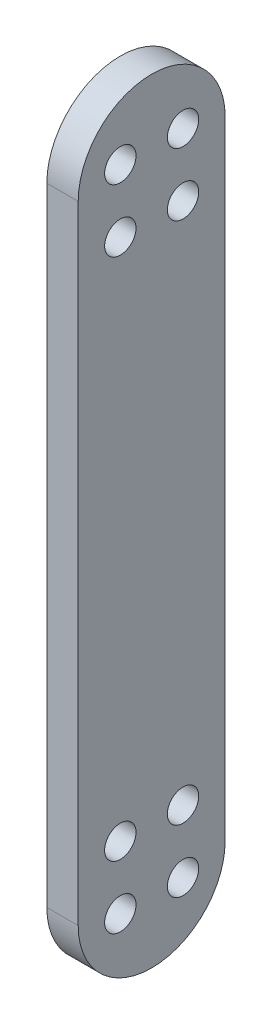
ISO-10303-21;
HEADER;
FILE_DESCRIPTION(('STEP AP214'),'2;1');
FILE_NAME('part.step','',(''),(''),'','','');
FILE_SCHEMA(('AUTOMOTIVE_DESIGN { 1 0 10303 214 1 1 1 1 }'));
ENDSEC;
DATA;
#1=APPLICATION_CONTEXT('core data for automotive mechanical design processes');
#2=APPLICATION_PROTOCOL_DEFINITION('international standard','automotive_design',2000,#1);
#3=PRODUCT_CONTEXT('',#1,'mechanical');
#4=PRODUCT('Part','Part','',(#3));
#5=PRODUCT_RELATED_PRODUCT_CATEGORY('part','',(#4));
#6=PRODUCT_DEFINITION_FORMATION('','',#4);
#7=PRODUCT_DEFINITION_CONTEXT('part definition',#1,'design');
#8=PRODUCT_DEFINITION('design','',#6,#7);
#9=PRODUCT_DEFINITION_SHAPE('','',#8);
#10=(LENGTH_UNIT() NAMED_UNIT(*) SI_UNIT(.MILLI.,.METRE.));
#11=(NAMED_UNIT(*) PLANE_ANGLE_UNIT() SI_UNIT($,.RADIAN.));
#12=(NAMED_UNIT(*) SI_UNIT($,.STERADIAN.) SOLID_ANGLE_UNIT());
#13=UNCERTAINTY_MEASURE_WITH_UNIT(LENGTH_MEASURE(1.E-05),#10,'distance_accuracy_value','');
#14=(GEOMETRIC_REPRESENTATION_CONTEXT(3) GLOBAL_UNCERTAINTY_ASSIGNED_CONTEXT((#13)) GLOBAL_UNIT_ASSIGNED_CONTEXT((#10,
#11,#12)) REPRESENTATION_CONTEXT('',''));
#15=CARTESIAN_POINT('',(0.,0.,0.));
#16=DIRECTION('',(0.,0.,1.));
#17=DIRECTION('',(1.,0.,0.));
#18=AXIS2_PLACEMENT_3D('',#15,#16,#17);
#19=CARTESIAN_POINT('',(0.,0.,0.));
#20=DIRECTION('',(-1.,0.,0.));
#21=DIRECTION('',(0.,0.,1.));
#22=AXIS2_PLACEMENT_3D('',#19,#20,#21);
#23=PLANE('',#22);
#24=CARTESIAN_POINT('',(0.,125.413224236194,25.));
#25=DIRECTION('',(-1.,0.,0.));
#26=DIRECTION('',(0.,0.,1.));
#27=AXIS2_PLACEMENT_3D('',#24,#25,#26);
#28=CIRCLE('',#27,2.5);
#29=CARTESIAN_POINT('',(0.,125.413224236194,27.5));
#30=VERTEX_POINT('',#29);
#31=EDGE_CURVE('E139',#30,#30,#28,.T.);
#32=ORIENTED_EDGE('',*,*,#31,.T.);
#33=EDGE_LOOP('',(#32));
#34=FACE_BOUND('',#33,.T.);
#35=CARTESIAN_POINT('',(0.,125.413224236194,15.));
#36=DIRECTION('',(-1.,0.,0.));
#37=DIRECTION('',(0.,0.,1.));
#38=AXIS2_PLACEMENT_3D('',#35,#36,#37);
#39=CIRCLE('',#38,2.5);
#40=CARTESIAN_POINT('',(0.,125.413224236194,17.5));
#41=VERTEX_POINT('',#40);
#42=EDGE_CURVE('E123',#41,#41,#39,.T.);
#43=ORIENTED_EDGE('',*,*,#42,.T.);
#44=EDGE_LOOP('',(#43));
#45=FACE_BOUND('',#44,.T.);
#46=CARTESIAN_POINT('',(0.,135.413224236194,25.));
#47=DIRECTION('',(-1.,0.,0.));
#48=DIRECTION('',(0.,0.,1.));
#49=AXIS2_PLACEMENT_3D('',#46,#47,#48);
#50=CIRCLE('',#49,2.5);
#51=CARTESIAN_POINT('',(0.,135.413224236194,27.5));
#52=VERTEX_POINT('',#51);
#53=EDGE_CURVE('E119',#52,#52,#50,.T.);
#54=ORIENTED_EDGE('',*,*,#53,.T.);
#55=EDGE_LOOP('',(#54));
#56=FACE_BOUND('',#55,.T.);
#57=CARTESIAN_POINT('',(0.,135.413224236194,15.));
#58=DIRECTION('',(-1.,0.,0.));
#59=DIRECTION('',(0.,0.,1.));
#60=AXIS2_PLACEMENT_3D('',#57,#58,#59);
#61=CIRCLE('',#60,2.5);
#62=CARTESIAN_POINT('',(0.,135.413224236194,17.5));
#63=VERTEX_POINT('',#62);
#64=EDGE_CURVE('E116',#63,#63,#61,.T.);
#65=ORIENTED_EDGE('',*,*,#64,.T.);
#66=EDGE_LOOP('',(#65));
#67=FACE_BOUND('',#66,.T.);
#68=CARTESIAN_POINT('',(0.,133.697961809387,20.));
#69=DIRECTION('',(-1.,0.,0.));
#70=DIRECTION('',(0.,0.,1.));
#71=AXIS2_PLACEMENT_3D('',#68,#69,#70);
#72=CIRCLE('',#71,11.715262426807);
#73=CARTESIAN_POINT('',(0.,133.697961809387,31.715262426807));
#74=VERTEX_POINT('',#73);
#75=CARTESIAN_POINT('',(0.,133.697961809387,8.28473757319303));
#76=VERTEX_POINT('',#75);
#77=EDGE_CURVE('E135',#74,#76,#72,.T.);
#78=ORIENTED_EDGE('',*,*,#77,.F.);
#79=DIRECTION('',(0.,-1.,0.));
#80=VECTOR('',#79,1.);
#81=CARTESIAN_POINT('',(0.,0.,31.715262426807));
#82=LINE('',#81,#80);
#83=CARTESIAN_POINT('',(0.,33.6979618093871,31.715262426807));
#84=VERTEX_POINT('',#83);
#85=EDGE_CURVE('E55',#74,#84,#82,.T.);
#86=ORIENTED_EDGE('',*,*,#85,.T.);
#87=CARTESIAN_POINT('',(0.,33.6979618093871,20.));
#88=DIRECTION('',(-1.,0.,0.));
#89=DIRECTION('',(0.,0.,1.));
#90=AXIS2_PLACEMENT_3D('',#87,#88,#89);
#91=CIRCLE('',#90,11.715262426807);
#92=CARTESIAN_POINT('',(0.,33.6979618093871,8.28473757319303));
#93=VERTEX_POINT('',#92);
#94=EDGE_CURVE('E84',#93,#84,#91,.T.);
#95=ORIENTED_EDGE('',*,*,#94,.F.);
#96=DIRECTION('',(0.,1.,0.));
#97=VECTOR('',#96,1.);
#98=CARTESIAN_POINT('',(0.,0.,8.28473757319303));
#99=LINE('',#98,#97);
#100=EDGE_CURVE('E129',#93,#76,#99,.T.);
#101=ORIENTED_EDGE('',*,*,#100,.T.);
#102=EDGE_LOOP('',(#78,#86,#95,#101));
#103=FACE_BOUND('',#102,.T.);
#104=CARTESIAN_POINT('',(0.,31.9826993825801,25.));
#105=DIRECTION('',(-1.,0.,0.));
#106=DIRECTION('',(0.,0.,1.));
#107=AXIS2_PLACEMENT_3D('',#104,#105,#106);
#108=CIRCLE('',#107,2.5);
#109=CARTESIAN_POINT('',(0.,31.9826993825801,27.5));
#110=VERTEX_POINT('',#109);
#111=EDGE_CURVE('E13',#110,#110,#108,.F.);
#112=ORIENTED_EDGE('',*,*,#111,.F.);
#113=EDGE_LOOP('',(#112));
#114=FACE_BOUND('',#113,.T.);
#115=CARTESIAN_POINT('',(0.,31.9826993825801,15.));
#116=DIRECTION('',(-1.,0.,0.));
#117=DIRECTION('',(0.,0.,1.));
#118=AXIS2_PLACEMENT_3D('',#115,#116,#117);
#119=CIRCLE('',#118,2.5);
#120=CARTESIAN_POINT('',(0.,31.9826993825801,17.5));
#121=VERTEX_POINT('',#120);
#122=EDGE_CURVE('E125',#121,#121,#119,.F.);
#123=ORIENTED_EDGE('',*,*,#122,.F.);
#124=EDGE_LOOP('',(#123));
#125=FACE_BOUND('',#124,.T.);
#126=CARTESIAN_POINT('',(0.,41.9826993825801,25.));
#127=DIRECTION('',(-1.,0.,0.));
#128=DIRECTION('',(0.,0.,1.));
#129=AXIS2_PLACEMENT_3D('',#126,#127,#128);
#130=CIRCLE('',#129,2.5);
#131=CARTESIAN_POINT('',(0.,41.9826993825801,27.5));
#132=VERTEX_POINT('',#131);
#133=EDGE_CURVE('E130',#132,#132,#130,.F.);
#134=ORIENTED_EDGE('',*,*,#133,.F.);
#135=EDGE_LOOP('',(#134));
#136=FACE_BOUND('',#135,.T.);
#137=CARTESIAN_POINT('',(0.,41.9826993825801,15.));
#138=DIRECTION('',(-1.,0.,0.));
#139=DIRECTION('',(0.,0.,1.));
#140=AXIS2_PLACEMENT_3D('',#137,#138,#139);
#141=CIRCLE('',#140,2.5);
#142=CARTESIAN_POINT('',(0.,41.9826993825801,17.5));
#143=VERTEX_POINT('',#142);
#144=EDGE_CURVE('E120',#143,#143,#141,.F.);
#145=ORIENTED_EDGE('',*,*,#144,.F.);
#146=EDGE_LOOP('',(#145));
#147=FACE_BOUND('',#146,.T.);
#148=ADVANCED_FACE('F45',(#34,#45,#56,#67,#103,#114,#125,#136,#147),#23,.F.);
#149=CARTESIAN_POINT('',(-5.,0.,8.28473757319303));
#150=DIRECTION('',(0.,0.,-1.));
#151=DIRECTION('',(-1.,0.,0.));
#152=AXIS2_PLACEMENT_3D('',#149,#150,#151);
#153=PLANE('',#152);
#154=ORIENTED_EDGE('',*,*,#100,.F.);
#155=DIRECTION('',(1.,0.,0.));
#156=VECTOR('',#155,1.);
#157=CARTESIAN_POINT('',(-5.,33.6979618093871,8.28473757319303));
#158=LINE('',#157,#156);
#159=CARTESIAN_POINT('',(-5.,33.6979618093871,8.28473757319303));
#160=VERTEX_POINT('',#159);
#161=EDGE_CURVE('E49',#160,#93,#158,.T.);
#162=ORIENTED_EDGE('',*,*,#161,.F.);
#163=DIRECTION('',(0.,1.,0.));
#164=VECTOR('',#163,1.);
#165=CARTESIAN_POINT('',(-5.,0.,8.28473757319303));
#166=LINE('',#165,#164);
#167=CARTESIAN_POINT('',(-5.,133.697961809387,8.28473757319303));
#168=VERTEX_POINT('',#167);
#169=EDGE_CURVE('E98',#160,#168,#166,.T.);
#170=ORIENTED_EDGE('',*,*,#169,.T.);
#171=DIRECTION('',(1.,0.,0.));
#172=VECTOR('',#171,1.);
#173=CARTESIAN_POINT('',(-5.,133.697961809387,8.28473757319303));
#174=LINE('',#173,#172);
#175=EDGE_CURVE('E115',#168,#76,#174,.T.);
#176=ORIENTED_EDGE('',*,*,#175,.T.);
#177=EDGE_LOOP('',(#154,#162,#170,#176));
#178=FACE_BOUND('',#177,.T.);
#179=ADVANCED_FACE('F153',(#178),#153,.T.);
#180=CARTESIAN_POINT('',(-5.,33.6979618093871,20.));
#181=DIRECTION('',(1.,0.,0.));
#182=DIRECTION('',(0.,0.,-1.));
#183=AXIS2_PLACEMENT_3D('',#180,#181,#182);
#184=CYLINDRICAL_SURFACE('',#183,11.715262426807);
#185=ORIENTED_EDGE('',*,*,#94,.T.);
#186=DIRECTION('',(1.,0.,0.));
#187=VECTOR('',#186,1.);
#188=CARTESIAN_POINT('',(-5.,33.6979618093871,31.715262426807));
#189=LINE('',#188,#187);
#190=CARTESIAN_POINT('',(-5.,33.6979618093871,31.715262426807));
#191=VERTEX_POINT('',#190);
#192=EDGE_CURVE('E101',#191,#84,#189,.T.);
#193=ORIENTED_EDGE('',*,*,#192,.F.);
#194=CARTESIAN_POINT('',(-5.,33.6979618093871,20.));
#195=DIRECTION('',(-1.,0.,0.));
#196=DIRECTION('',(0.,0.,1.));
#197=AXIS2_PLACEMENT_3D('',#194,#195,#196);
#198=CIRCLE('',#197,11.715262426807);
#199=EDGE_CURVE('E91',#160,#191,#198,.T.);
#200=ORIENTED_EDGE('',*,*,#199,.F.);
#201=ORIENTED_EDGE('',*,*,#161,.T.);
#202=EDGE_LOOP('',(#185,#193,#200,#201));
#203=FACE_BOUND('',#202,.T.);
#204=ADVANCED_FACE('F102',(#203),#184,.T.);
#205=CARTESIAN_POINT('',(-5.,0.,31.715262426807));
#206=DIRECTION('',(0.,0.,1.));
#207=DIRECTION('',(1.,0.,0.));
#208=AXIS2_PLACEMENT_3D('',#205,#206,#207);
#209=PLANE('',#208);
#210=ORIENTED_EDGE('',*,*,#85,.F.);
#211=DIRECTION('',(1.,0.,0.));
#212=VECTOR('',#211,1.);
#213=CARTESIAN_POINT('',(-5.,133.697961809387,31.715262426807));
#214=LINE('',#213,#212);
#215=CARTESIAN_POINT('',(-5.,133.697961809387,31.715262426807));
#216=VERTEX_POINT('',#215);
#217=EDGE_CURVE('E103',#216,#74,#214,.T.);
#218=ORIENTED_EDGE('',*,*,#217,.F.);
#219=DIRECTION('',(0.,-1.,0.));
#220=VECTOR('',#219,1.);
#221=CARTESIAN_POINT('',(-5.,0.,31.715262426807));
#222=LINE('',#221,#220);
#223=EDGE_CURVE('E96',#216,#191,#222,.T.);
#224=ORIENTED_EDGE('',*,*,#223,.T.);
#225=ORIENTED_EDGE('',*,*,#192,.T.);
#226=EDGE_LOOP('',(#210,#218,#224,#225));
#227=FACE_BOUND('',#226,.T.);
#228=ADVANCED_FACE('F104',(#227),#209,.T.);
#229=CARTESIAN_POINT('',(-5.,41.9826993825801,15.));
#230=DIRECTION('',(1.,0.,0.));
#231=DIRECTION('',(0.,0.,-1.));
#232=AXIS2_PLACEMENT_3D('',#229,#230,#231);
#233=CYLINDRICAL_SURFACE('',#232,2.5);
#234=CARTESIAN_POINT('',(-5.,41.9826993825801,15.));
#235=DIRECTION('',(-1.,0.,0.));
#236=DIRECTION('',(0.,0.,1.));
#237=AXIS2_PLACEMENT_3D('',#234,#235,#236);
#238=CIRCLE('',#237,2.5);
#239=CARTESIAN_POINT('',(-5.,41.9826993825801,17.5));
#240=VERTEX_POINT('',#239);
#241=EDGE_CURVE('E106',#240,#240,#238,.F.);
#242=ORIENTED_EDGE('',*,*,#241,.F.);
#243=EDGE_LOOP('',(#242));
#244=FACE_BOUND('',#243,.T.);
#245=ORIENTED_EDGE('',*,*,#144,.T.);
#246=EDGE_LOOP('',(#245));
#247=FACE_BOUND('',#246,.T.);
#248=ADVANCED_FACE('F202',(#244,#247),#233,.F.);
#249=CARTESIAN_POINT('',(-5.,133.697961809387,20.));
#250=DIRECTION('',(1.,0.,0.));
#251=DIRECTION('',(0.,0.,-1.));
#252=AXIS2_PLACEMENT_3D('',#249,#250,#251);
#253=CYLINDRICAL_SURFACE('',#252,11.715262426807);
#254=ORIENTED_EDGE('',*,*,#77,.T.);
#255=ORIENTED_EDGE('',*,*,#175,.F.);
#256=CARTESIAN_POINT('',(-5.,133.697961809387,20.));
#257=DIRECTION('',(-1.,0.,0.));
#258=DIRECTION('',(0.,0.,1.));
#259=AXIS2_PLACEMENT_3D('',#256,#257,#258);
#260=CIRCLE('',#259,11.715262426807);
#261=EDGE_CURVE('E64',#216,#168,#260,.T.);
#262=ORIENTED_EDGE('',*,*,#261,.F.);
#263=ORIENTED_EDGE('',*,*,#217,.T.);
#264=EDGE_LOOP('',(#254,#255,#262,#263));
#265=FACE_BOUND('',#264,.T.);
#266=ADVANCED_FACE('F149',(#265),#253,.T.);
#267=CARTESIAN_POINT('',(-5.,41.9826993825801,25.));
#268=DIRECTION('',(1.,0.,0.));
#269=DIRECTION('',(0.,0.,-1.));
#270=AXIS2_PLACEMENT_3D('',#267,#268,#269);
#271=CYLINDRICAL_SURFACE('',#270,2.5);
#272=CARTESIAN_POINT('',(-5.,41.9826993825801,25.));
#273=DIRECTION('',(-1.,0.,0.));
#274=DIRECTION('',(0.,0.,1.));
#275=AXIS2_PLACEMENT_3D('',#272,#273,#274);
#276=CIRCLE('',#275,2.5);
#277=CARTESIAN_POINT('',(-5.,41.9826993825801,27.5));
#278=VERTEX_POINT('',#277);
#279=EDGE_CURVE('E154',#278,#278,#276,.F.);
#280=ORIENTED_EDGE('',*,*,#279,.F.);
#281=EDGE_LOOP('',(#280));
#282=FACE_BOUND('',#281,.T.);
#283=ORIENTED_EDGE('',*,*,#133,.T.);
#284=EDGE_LOOP('',(#283));
#285=FACE_BOUND('',#284,.T.);
#286=ADVANCED_FACE('F189',(#282,#285),#271,.F.);
#287=CARTESIAN_POINT('',(-5.,31.9826993825801,15.));
#288=DIRECTION('',(1.,0.,0.));
#289=DIRECTION('',(0.,0.,-1.));
#290=AXIS2_PLACEMENT_3D('',#287,#288,#289);
#291=CYLINDRICAL_SURFACE('',#290,2.5);
#292=CARTESIAN_POINT('',(-5.,31.9826993825801,15.));
#293=DIRECTION('',(-1.,0.,0.));
#294=DIRECTION('',(0.,0.,1.));
#295=AXIS2_PLACEMENT_3D('',#292,#293,#294);
#296=CIRCLE('',#295,2.5);
#297=CARTESIAN_POINT('',(-5.,31.9826993825801,17.5));
#298=VERTEX_POINT('',#297);
#299=EDGE_CURVE('E156',#298,#298,#296,.F.);
#300=ORIENTED_EDGE('',*,*,#299,.F.);
#301=EDGE_LOOP('',(#300));
#302=FACE_BOUND('',#301,.T.);
#303=ORIENTED_EDGE('',*,*,#122,.T.);
#304=EDGE_LOOP('',(#303));
#305=FACE_BOUND('',#304,.T.);
#306=ADVANCED_FACE('F192',(#302,#305),#291,.F.);
#307=CARTESIAN_POINT('',(-5.,31.9826993825801,25.));
#308=DIRECTION('',(1.,0.,0.));
#309=DIRECTION('',(0.,0.,-1.));
#310=AXIS2_PLACEMENT_3D('',#307,#308,#309);
#311=CYLINDRICAL_SURFACE('',#310,2.5);
#312=CARTESIAN_POINT('',(-5.,31.9826993825801,25.));
#313=DIRECTION('',(-1.,0.,0.));
#314=DIRECTION('',(0.,0.,1.));
#315=AXIS2_PLACEMENT_3D('',#312,#313,#314);
#316=CIRCLE('',#315,2.5);
#317=CARTESIAN_POINT('',(-5.,31.9826993825801,27.5));
#318=VERTEX_POINT('',#317);
#319=EDGE_CURVE('E161',#318,#318,#316,.F.);
#320=ORIENTED_EDGE('',*,*,#319,.F.);
#321=EDGE_LOOP('',(#320));
#322=FACE_BOUND('',#321,.T.);
#323=ORIENTED_EDGE('',*,*,#111,.T.);
#324=EDGE_LOOP('',(#323));
#325=FACE_BOUND('',#324,.T.);
#326=ADVANCED_FACE('F221',(#322,#325),#311,.F.);
#327=CARTESIAN_POINT('',(-5.,125.413224236194,15.));
#328=DIRECTION('',(1.,0.,0.));
#329=DIRECTION('',(0.,0.,-1.));
#330=AXIS2_PLACEMENT_3D('',#327,#328,#329);
#331=CYLINDRICAL_SURFACE('',#330,2.5);
#332=CARTESIAN_POINT('',(-5.,125.413224236194,15.));
#333=DIRECTION('',(-1.,0.,0.));
#334=DIRECTION('',(0.,0.,1.));
#335=AXIS2_PLACEMENT_3D('',#332,#333,#334);
#336=CIRCLE('',#335,2.5);
#337=CARTESIAN_POINT('',(-5.,125.413224236194,17.5));
#338=VERTEX_POINT('',#337);
#339=EDGE_CURVE('E164',#338,#338,#336,.T.);
#340=ORIENTED_EDGE('',*,*,#339,.T.);
#341=EDGE_LOOP('',(#340));
#342=FACE_BOUND('',#341,.T.);
#343=ORIENTED_EDGE('',*,*,#42,.F.);
#344=EDGE_LOOP('',(#343));
#345=FACE_BOUND('',#344,.T.);
#346=ADVANCED_FACE('F225',(#342,#345),#331,.F.);
#347=CARTESIAN_POINT('',(-5.,135.413224236194,25.));
#348=DIRECTION('',(1.,0.,0.));
#349=DIRECTION('',(0.,0.,-1.));
#350=AXIS2_PLACEMENT_3D('',#347,#348,#349);
#351=CYLINDRICAL_SURFACE('',#350,2.5);
#352=CARTESIAN_POINT('',(-5.,135.413224236194,25.));
#353=DIRECTION('',(-1.,0.,0.));
#354=DIRECTION('',(0.,0.,1.));
#355=AXIS2_PLACEMENT_3D('',#352,#353,#354);
#356=CIRCLE('',#355,2.5);
#357=CARTESIAN_POINT('',(-5.,135.413224236194,27.5));
#358=VERTEX_POINT('',#357);
#359=EDGE_CURVE('E167',#358,#358,#356,.T.);
#360=ORIENTED_EDGE('',*,*,#359,.T.);
#361=EDGE_LOOP('',(#360));
#362=FACE_BOUND('',#361,.T.);
#363=ORIENTED_EDGE('',*,*,#53,.F.);
#364=EDGE_LOOP('',(#363));
#365=FACE_BOUND('',#364,.T.);
#366=ADVANCED_FACE('F228',(#362,#365),#351,.F.);
#367=CARTESIAN_POINT('',(-5.,135.413224236194,15.));
#368=DIRECTION('',(1.,0.,0.));
#369=DIRECTION('',(0.,0.,-1.));
#370=AXIS2_PLACEMENT_3D('',#367,#368,#369);
#371=CYLINDRICAL_SURFACE('',#370,2.5);
#372=CARTESIAN_POINT('',(-5.,135.413224236194,15.));
#373=DIRECTION('',(-1.,0.,0.));
#374=DIRECTION('',(0.,0.,1.));
#375=AXIS2_PLACEMENT_3D('',#372,#373,#374);
#376=CIRCLE('',#375,2.5);
#377=CARTESIAN_POINT('',(-5.,135.413224236194,17.5));
#378=VERTEX_POINT('',#377);
#379=EDGE_CURVE('E144',#378,#378,#376,.T.);
#380=ORIENTED_EDGE('',*,*,#379,.T.);
#381=EDGE_LOOP('',(#380));
#382=FACE_BOUND('',#381,.T.);
#383=ORIENTED_EDGE('',*,*,#64,.F.);
#384=EDGE_LOOP('',(#383));
#385=FACE_BOUND('',#384,.T.);
#386=ADVANCED_FACE('F47',(#382,#385),#371,.F.);
#387=CARTESIAN_POINT('',(-5.,125.413224236194,25.));
#388=DIRECTION('',(1.,0.,0.));
#389=DIRECTION('',(0.,0.,-1.));
#390=AXIS2_PLACEMENT_3D('',#387,#388,#389);
#391=CYLINDRICAL_SURFACE('',#390,2.5);
#392=CARTESIAN_POINT('',(-5.,125.413224236194,25.));
#393=DIRECTION('',(-1.,0.,0.));
#394=DIRECTION('',(0.,0.,1.));
#395=AXIS2_PLACEMENT_3D('',#392,#393,#394);
#396=CIRCLE('',#395,2.5);
#397=CARTESIAN_POINT('',(-5.,125.413224236194,27.5));
#398=VERTEX_POINT('',#397);
#399=EDGE_CURVE('E112',#398,#398,#396,.T.);
#400=ORIENTED_EDGE('',*,*,#399,.T.);
#401=EDGE_LOOP('',(#400));
#402=FACE_BOUND('',#401,.T.);
#403=ORIENTED_EDGE('',*,*,#31,.F.);
#404=EDGE_LOOP('',(#403));
#405=FACE_BOUND('',#404,.T.);
#406=ADVANCED_FACE('F177',(#402,#405),#391,.F.);
#407=CARTESIAN_POINT('',(-5.,0.,0.));
#408=DIRECTION('',(-1.,0.,0.));
#409=DIRECTION('',(0.,0.,1.));
#410=AXIS2_PLACEMENT_3D('',#407,#408,#409);
#411=PLANE('',#410);
#412=ORIENTED_EDGE('',*,*,#379,.F.);
#413=EDGE_LOOP('',(#412));
#414=FACE_BOUND('',#413,.T.);
#415=ORIENTED_EDGE('',*,*,#359,.F.);
#416=EDGE_LOOP('',(#415));
#417=FACE_BOUND('',#416,.T.);
#418=ORIENTED_EDGE('',*,*,#339,.F.);
#419=EDGE_LOOP('',(#418));
#420=FACE_BOUND('',#419,.T.);
#421=ORIENTED_EDGE('',*,*,#319,.T.);
#422=EDGE_LOOP('',(#421));
#423=FACE_BOUND('',#422,.T.);
#424=ORIENTED_EDGE('',*,*,#299,.T.);
#425=EDGE_LOOP('',(#424));
#426=FACE_BOUND('',#425,.T.);
#427=ORIENTED_EDGE('',*,*,#279,.T.);
#428=EDGE_LOOP('',(#427));
#429=FACE_BOUND('',#428,.T.);
#430=ORIENTED_EDGE('',*,*,#169,.F.);
#431=ORIENTED_EDGE('',*,*,#199,.T.);
#432=ORIENTED_EDGE('',*,*,#223,.F.);
#433=ORIENTED_EDGE('',*,*,#261,.T.);
#434=EDGE_LOOP('',(#430,#431,#432,#433));
#435=FACE_BOUND('',#434,.T.);
#436=ORIENTED_EDGE('',*,*,#241,.T.);
#437=EDGE_LOOP('',(#436));
#438=FACE_BOUND('',#437,.T.);
#439=ORIENTED_EDGE('',*,*,#399,.F.);
#440=EDGE_LOOP('',(#439));
#441=FACE_BOUND('',#440,.T.);
#442=ADVANCED_FACE('F93',(#414,#417,#420,#423,#426,#429,#435,#438,#441),#411,.T.);
#443=CLOSED_SHELL('',(#148,#179,#204,#228,#248,#266,#286,#306,#326,#346,#366,#386,#406,#442));
#444=MANIFOLD_SOLID_BREP('B2',#443);
#445=ADVANCED_BREP_SHAPE_REPRESENTATION('',(#18,#444),#14);
#446=SHAPE_DEFINITION_REPRESENTATION(#9,#445);
ENDSEC;
END-ISO-10303-21;
